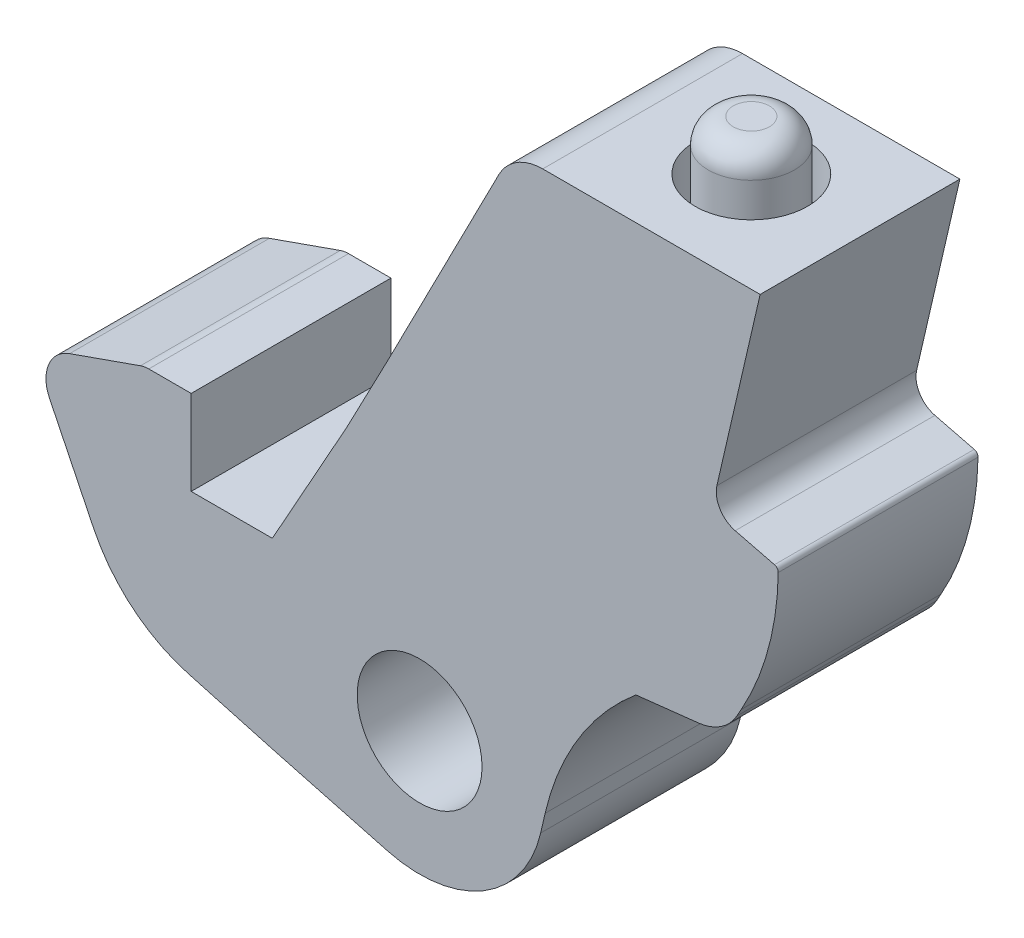
ISO-10303-21;
HEADER;
FILE_DESCRIPTION(('STEP AP214'),'2;1');
FILE_NAME('part.step','',(''),(''),'','','');
FILE_SCHEMA(('AUTOMOTIVE_DESIGN { 1 0 10303 214 1 1 1 1 }'));
ENDSEC;
DATA;
#1=APPLICATION_CONTEXT('core data for automotive mechanical design processes');
#2=APPLICATION_PROTOCOL_DEFINITION('international standard','automotive_design',2000,#1);
#3=PRODUCT_CONTEXT('',#1,'mechanical');
#4=PRODUCT('Part','Part','',(#3));
#5=PRODUCT_RELATED_PRODUCT_CATEGORY('part','',(#4));
#6=PRODUCT_DEFINITION_FORMATION('','',#4);
#7=PRODUCT_DEFINITION_CONTEXT('part definition',#1,'design');
#8=PRODUCT_DEFINITION('design','',#6,#7);
#9=PRODUCT_DEFINITION_SHAPE('','',#8);
#10=(LENGTH_UNIT() NAMED_UNIT(*) SI_UNIT(.MILLI.,.METRE.));
#11=(NAMED_UNIT(*) PLANE_ANGLE_UNIT() SI_UNIT($,.RADIAN.));
#12=(NAMED_UNIT(*) SI_UNIT($,.STERADIAN.) SOLID_ANGLE_UNIT());
#13=UNCERTAINTY_MEASURE_WITH_UNIT(LENGTH_MEASURE(1.E-05),#10,'distance_accuracy_value','');
#14=(GEOMETRIC_REPRESENTATION_CONTEXT(3) GLOBAL_UNCERTAINTY_ASSIGNED_CONTEXT((#13)) GLOBAL_UNIT_ASSIGNED_CONTEXT((#10,
#11,#12)) REPRESENTATION_CONTEXT('',''));
#15=CARTESIAN_POINT('',(0.,0.,0.));
#16=DIRECTION('',(0.,0.,1.));
#17=DIRECTION('',(1.,0.,0.));
#18=AXIS2_PLACEMENT_3D('',#15,#16,#17);
#19=CARTESIAN_POINT('',(-7.66797220054773,0.2710604918166,8.));
#20=DIRECTION('',(0.,0.,-1.));
#21=DIRECTION('',(-1.,0.,0.));
#22=AXIS2_PLACEMENT_3D('',#19,#20,#21);
#23=PLANE('',#22);
#24=DIRECTION('',(-1.,0.,0.));
#25=VECTOR('',#24,1.);
#26=CARTESIAN_POINT('',(-2.71922810393467,-2.1289395081834,8.));
#27=LINE('',#26,#25);
#28=CARTESIAN_POINT('',(-2.71922810393467,-2.1289395081834,8.));
#29=VERTEX_POINT('',#28);
#30=CARTESIAN_POINT('',(-5.96953612919984,-2.1289395081834,8.));
#31=VERTEX_POINT('',#30);
#32=EDGE_CURVE('E291',#29,#31,#27,.T.);
#33=ORIENTED_EDGE('',*,*,#32,.T.);
#34=DIRECTION('',(0.,1.,0.));
#35=VECTOR('',#34,1.);
#36=CARTESIAN_POINT('',(-5.96953612919984,-2.1289395081834,8.));
#37=LINE('',#36,#35);
#38=CARTESIAN_POINT('',(-5.96953612919984,1.2710604918166,8.));
#39=VERTEX_POINT('',#38);
#40=EDGE_CURVE('E148',#31,#39,#37,.T.);
#41=ORIENTED_EDGE('',*,*,#40,.T.);
#42=DIRECTION('',(-1.,0.,0.));
#43=VECTOR('',#42,1.);
#44=CARTESIAN_POINT('',(-5.96953612919984,1.2710604918166,8.));
#45=LINE('',#44,#43);
#46=CARTESIAN_POINT('',(-7.66797220054773,1.2710604918166,8.));
#47=VERTEX_POINT('',#46);
#48=EDGE_CURVE('E490',#39,#47,#45,.T.);
#49=ORIENTED_EDGE('',*,*,#48,.T.);
#50=CARTESIAN_POINT('',(-7.66797220054773,0.2710604918166,8.));
#51=DIRECTION('',(0.,0.,1.));
#52=DIRECTION('',(-1.,0.,0.));
#53=AXIS2_PLACEMENT_3D('',#50,#51,#52);
#54=CIRCLE('',#53,1.);
#55=CARTESIAN_POINT('',(-7.99980347927855,1.21439924457505,8.));
#56=VERTEX_POINT('',#55);
#57=EDGE_CURVE('E492',#47,#56,#54,.T.);
#58=ORIENTED_EDGE('',*,*,#57,.T.);
#59=DIRECTION('',(-0.943338752758449,-0.331831278730823,0.));
#60=VECTOR('',#59,1.);
#61=CARTESIAN_POINT('',(-7.99980347927855,1.21439924457505,8.));
#62=LINE('',#61,#60);
#63=CARTESIAN_POINT('',(-10.8390325666476,0.215664679800225,8.));
#64=VERTEX_POINT('',#63);
#65=EDGE_CURVE('E494',#56,#64,#62,.T.);
#66=ORIENTED_EDGE('',*,*,#65,.T.);
#67=CARTESIAN_POINT('',(-10.3692845071763,-1.1197475520644,8.));
#68=DIRECTION('',(0.,0.,1.));
#69=DIRECTION('',(1.,0.,0.));
#70=AXIS2_PLACEMENT_3D('',#67,#68,#69);
#71=CIRCLE('',#70,1.41562320848126);
#72=CARTESIAN_POINT('',(-11.6418752942782,-1.73982960871022,8.));
#73=VERTEX_POINT('',#72);
#74=EDGE_CURVE('E500',#64,#73,#71,.T.);
#75=ORIENTED_EDGE('',*,*,#74,.T.);
#76=DIRECTION('',(0.438027614220226,-0.898961517074305,0.));
#77=VECTOR('',#76,1.);
#78=CARTESIAN_POINT('',(-9.88186594515273,-5.35188652747633,8.));
#79=LINE('',#78,#77);
#80=CARTESIAN_POINT('',(-9.88186594515273,-5.35188652747633,8.));
#81=VERTEX_POINT('',#80);
#82=EDGE_CURVE('E502',#73,#81,#79,.T.);
#83=ORIENTED_EDGE('',*,*,#82,.T.);
#84=CARTESIAN_POINT('',(-4.4880968427069,-2.72372084215497,8.));
#85=DIRECTION('',(0.,0.,1.));
#86=DIRECTION('',(1.,0.,0.));
#87=AXIS2_PLACEMENT_3D('',#84,#85,#86);
#88=CIRCLE('',#87,6.);
#89=CARTESIAN_POINT('',(-6.08665836566715,-8.50685157362828,8.));
#90=VERTEX_POINT('',#89);
#91=EDGE_CURVE('E504',#81,#90,#88,.T.);
#92=ORIENTED_EDGE('',*,*,#91,.T.);
#93=DIRECTION('',(0.963855121912218,-0.266426920493374,0.));
#94=VECTOR('',#93,1.);
#95=CARTESIAN_POINT('',(-6.08665836566715,-8.50685157362828,8.));
#96=LINE('',#95,#94);
#97=CARTESIAN_POINT('',(-2.71392287900027,-9.43913642528591,8.));
#98=VERTEX_POINT('',#97);
#99=EDGE_CURVE('E506',#90,#98,#96,.T.);
#100=ORIENTED_EDGE('',*,*,#99,.T.);
#101=DIRECTION('',(0.966344454252272,-0.257251619500982,0.));
#102=VECTOR('',#101,1.);
#103=CARTESIAN_POINT('',(1.89917723923317,-10.6671948790947,8.));
#104=LINE('',#103,#102);
#105=CARTESIAN_POINT('',(1.89917723923317,-10.6671948790947,8.));
#106=VERTEX_POINT('',#105);
#107=EDGE_CURVE('E508',#98,#106,#104,.T.);
#108=ORIENTED_EDGE('',*,*,#107,.T.);
#109=CARTESIAN_POINT('',(3.17902607404032,-5.85954847361733,8.));
#110=DIRECTION('',(0.,0.,1.));
#111=DIRECTION('',(1.,0.,0.));
#112=AXIS2_PLACEMENT_3D('',#109,#110,#111);
#113=CIRCLE('',#112,4.9750856274095);
#114=CARTESIAN_POINT('',(8.02648483941013,-6.97920043654865,8.));
#115=VERTEX_POINT('',#114);
#116=EDGE_CURVE('E510',#106,#115,#113,.T.);
#117=ORIENTED_EDGE('',*,*,#116,.T.);
#118=DIRECTION('',(0.225051797453046,0.974346800920059,0.));
#119=VECTOR('',#118,1.);
#120=CARTESIAN_POINT('',(8.20546683586904,-6.20430977739535,8.));
#121=LINE('',#120,#119);
#122=CARTESIAN_POINT('',(8.20546683586904,-6.20430977739535,8.));
#123=VERTEX_POINT('',#122);
#124=EDGE_CURVE('E512',#115,#123,#121,.T.);
#125=ORIENTED_EDGE('',*,*,#124,.T.);
#126=CARTESIAN_POINT('',(18.8518579242714,-8.66338230533976,8.));
#127=DIRECTION('',(0.,0.,-1.));
#128=DIRECTION('',(1.,0.,0.));
#129=AXIS2_PLACEMENT_3D('',#126,#127,#128);
#130=CIRCLE('',#129,10.92669579081);
#131=CARTESIAN_POINT('',(11.8423294646064,-0.281306686613192,8.));
#132=VERTEX_POINT('',#131);
#133=EDGE_CURVE('E514',#123,#132,#130,.T.);
#134=ORIENTED_EDGE('',*,*,#133,.T.);
#135=DIRECTION('',(0.993792815702661,0.111246750324564,0.));
#136=VECTOR('',#135,1.);
#137=CARTESIAN_POINT('',(11.8423294646064,-0.281306686613192,8.));
#138=LINE('',#137,#136);
#139=CARTESIAN_POINT('',(14.3609080160023,0.000627007063032023,8.));
#140=VERTEX_POINT('',#139);
#141=EDGE_CURVE('E516',#132,#140,#138,.T.);
#142=ORIENTED_EDGE('',*,*,#141,.T.);
#143=CARTESIAN_POINT('',(14.1384145153532,1.98821263846836,8.));
#144=DIRECTION('',(0.,0.,1.));
#145=DIRECTION('',(-1.,0.,0.));
#146=AXIS2_PLACEMENT_3D('',#143,#144,#145);
#147=CIRCLE('',#146,2.);
#148=CARTESIAN_POINT('',(15.8802159379173,1.00529463356989,8.));
#149=VERTEX_POINT('',#148);
#150=EDGE_CURVE('E518',#140,#149,#147,.T.);
#151=ORIENTED_EDGE('',*,*,#150,.T.);
#152=DIRECTION('',(0.491459002449233,0.870900711282064,0.));
#153=VECTOR('',#152,1.);
#154=CARTESIAN_POINT('',(16.0590036028425,1.32211923903205,8.));
#155=LINE('',#154,#153);
#156=CARTESIAN_POINT('',(16.0590036028425,1.32211923903206,8.));
#157=VERTEX_POINT('',#156);
#158=EDGE_CURVE('E520',#149,#157,#155,.T.);
#159=ORIENTED_EDGE('',*,*,#158,.T.);
#160=CARTESIAN_POINT('',(6.04585510169578,6.97265082087592,8.));
#161=DIRECTION('',(0.,0.,1.));
#162=DIRECTION('',(-1.,0.,0.));
#163=AXIS2_PLACEMENT_3D('',#160,#161,#162);
#164=CIRCLE('',#163,11.4974627663425);
#165=CARTESIAN_POINT('',(17.5422212226345,6.81385511323671,8.));
#166=VERTEX_POINT('',#165);
#167=EDGE_CURVE('E522',#157,#166,#164,.T.);
#168=ORIENTED_EDGE('',*,*,#167,.T.);
#169=CARTESIAN_POINT('',(17.3422402989373,6.81661738715516,8.));
#170=DIRECTION('',(0.,0.,1.));
#171=DIRECTION('',(-1.,0.,0.));
#172=AXIS2_PLACEMENT_3D('',#169,#170,#171);
#173=CIRCLE('',#172,0.199999999999999);
#174=CARTESIAN_POINT('',(17.3905708662559,7.01068994127517,8.));
#175=VERTEX_POINT('',#174);
#176=EDGE_CURVE('E524',#166,#175,#173,.T.);
#177=ORIENTED_EDGE('',*,*,#176,.T.);
#178=DIRECTION('',(-0.970362770600016,0.241652836593037,0.));
#179=VECTOR('',#178,1.);
#180=CARTESIAN_POINT('',(15.8173507662495,7.40247444833808,8.));
#181=LINE('',#180,#179);
#182=CARTESIAN_POINT('',(15.8173507662495,7.40247444833808,8.));
#183=VERTEX_POINT('',#182);
#184=EDGE_CURVE('E526',#175,#183,#181,.T.);
#185=ORIENTED_EDGE('',*,*,#184,.T.);
#186=CARTESIAN_POINT('',(16.0590036028425,8.37283721893809,8.));
#187=DIRECTION('',(0.,0.,-1.));
#188=DIRECTION('',(1.,0.,0.));
#189=AXIS2_PLACEMENT_3D('',#186,#187,#188);
#190=CIRCLE('',#189,0.999999999999997);
#191=CARTESIAN_POINT('',(15.0846568019225,8.59788901639114,8.));
#192=VERTEX_POINT('',#191);
#193=EDGE_CURVE('E528',#183,#192,#190,.T.);
#194=ORIENTED_EDGE('',*,*,#193,.T.);
#195=DIRECTION('',(0.225051797453045,0.974346800920059,0.));
#196=VECTOR('',#195,1.);
#197=CARTESIAN_POINT('',(16.8169850440884,16.0978890163911,8.));
#198=LINE('',#197,#196);
#199=CARTESIAN_POINT('',(16.8169850440884,16.0978890163911,8.));
#200=VERTEX_POINT('',#199);
#201=EDGE_CURVE('E530',#192,#200,#198,.T.);
#202=ORIENTED_EDGE('',*,*,#201,.T.);
#203=DIRECTION('',(-1.,0.,0.));
#204=VECTOR('',#203,1.);
#205=CARTESIAN_POINT('',(13.7243034998767,16.0978890163912,8.));
#206=LINE('',#205,#204);
#207=CARTESIAN_POINT('',(8.11083442545163,16.0978890163912,8.));
#208=VERTEX_POINT('',#207);
#209=EDGE_CURVE('E532',#200,#208,#206,.T.);
#210=ORIENTED_EDGE('',*,*,#209,.T.);
#211=CARTESIAN_POINT('',(8.11083442545163,14.122920038043,8.));
#212=DIRECTION('',(0.,0.,1.));
#213=DIRECTION('',(1.,0.,0.));
#214=AXIS2_PLACEMENT_3D('',#211,#212,#213);
#215=CIRCLE('',#214,1.97496897834821);
#216=CARTESIAN_POINT('',(6.35357532167206,15.0243316574609,8.));
#217=VERTEX_POINT('',#216);
#218=EDGE_CURVE('E221',#208,#217,#215,.T.);
#219=ORIENTED_EDGE('',*,*,#218,.T.);
#220=DIRECTION('',(-0.45641811557558,-0.889765420644361,0.));
#221=VECTOR('',#220,1.);
#222=CARTESIAN_POINT('',(1.89917723923319,6.34069433394995,8.));
#223=LINE('',#222,#221);
#224=CARTESIAN_POINT('',(1.89917723923319,6.34069433394995,8.));
#225=VERTEX_POINT('',#224);
#226=EDGE_CURVE('E215',#217,#225,#223,.T.);
#227=ORIENTED_EDGE('',*,*,#226,.T.);
#228=DIRECTION('',(-0.463424730649865,-0.886136286934521,0.));
#229=VECTOR('',#228,1.);
#230=CARTESIAN_POINT('',(0.263428455002605,3.21290192636068,8.));
#231=LINE('',#230,#229);
#232=CARTESIAN_POINT('',(0.263428455002605,3.21290192636068,8.));
#233=VERTEX_POINT('',#232);
#234=EDGE_CURVE('E219',#225,#233,#231,.T.);
#235=ORIENTED_EDGE('',*,*,#234,.T.);
#236=DIRECTION('',(-0.487511174764697,-0.873116747336543,0.));
#237=VECTOR('',#236,1.);
#238=CARTESIAN_POINT('',(-2.71922810393467,-2.1289395081834,8.));
#239=LINE('',#238,#237);
#240=EDGE_CURVE('E50',#233,#29,#239,.T.);
#241=ORIENTED_EDGE('',*,*,#240,.T.);
#242=EDGE_LOOP('',(#33,#41,#49,#58,#66,#75,#83,#92,#100,#108,#117,#125,#134,#142,#151,#159,#168,
#177,#185,#194,#202,#210,#219,#227,#235,#241));
#243=FACE_BOUND('',#242,.T.);
#244=CARTESIAN_POINT('',(3.17902607404032,-5.85954847361733,8.));
#245=DIRECTION('',(0.,0.,1.));
#246=DIRECTION('',(1.,0.,0.));
#247=AXIS2_PLACEMENT_3D('',#244,#245,#246);
#248=CIRCLE('',#247,2.50000000000386);
#249=CARTESIAN_POINT('',(5.67902607404418,-5.85954847361733,8.));
#250=VERTEX_POINT('',#249);
#251=EDGE_CURVE('E243',#250,#250,#248,.T.);
#252=ORIENTED_EDGE('',*,*,#251,.F.);
#253=EDGE_LOOP('',(#252));
#254=FACE_BOUND('',#253,.T.);
#255=ADVANCED_FACE('F33',(#243,#254),#23,.F.);
#256=CARTESIAN_POINT('',(-7.66797220054773,0.2710604918166,0.));
#257=DIRECTION('',(0.,0.,-1.));
#258=DIRECTION('',(-1.,0.,0.));
#259=AXIS2_PLACEMENT_3D('',#256,#257,#258);
#260=PLANE('',#259);
#261=DIRECTION('',(-1.,0.,0.));
#262=VECTOR('',#261,1.);
#263=CARTESIAN_POINT('',(-2.71922810393467,-2.1289395081834,0.));
#264=LINE('',#263,#262);
#265=CARTESIAN_POINT('',(-2.71922810393467,-2.1289395081834,0.));
#266=VERTEX_POINT('',#265);
#267=CARTESIAN_POINT('',(-5.96953612919984,-2.1289395081834,0.));
#268=VERTEX_POINT('',#267);
#269=EDGE_CURVE('E239',#266,#268,#264,.T.);
#270=ORIENTED_EDGE('',*,*,#269,.F.);
#271=DIRECTION('',(-0.487511174764697,-0.873116747336543,0.));
#272=VECTOR('',#271,1.);
#273=CARTESIAN_POINT('',(-2.71922810393467,-2.1289395081834,0.));
#274=LINE('',#273,#272);
#275=CARTESIAN_POINT('',(0.263428455002605,3.21290192636068,0.));
#276=VERTEX_POINT('',#275);
#277=EDGE_CURVE('E139',#276,#266,#274,.T.);
#278=ORIENTED_EDGE('',*,*,#277,.F.);
#279=DIRECTION('',(-0.463424730649865,-0.886136286934521,0.));
#280=VECTOR('',#279,1.);
#281=CARTESIAN_POINT('',(0.263428455002605,3.21290192636068,0.));
#282=LINE('',#281,#280);
#283=CARTESIAN_POINT('',(1.89917723923319,6.34069433394995,0.));
#284=VERTEX_POINT('',#283);
#285=EDGE_CURVE('E133',#284,#276,#282,.T.);
#286=ORIENTED_EDGE('',*,*,#285,.F.);
#287=DIRECTION('',(-0.45641811557558,-0.889765420644361,0.));
#288=VECTOR('',#287,1.);
#289=CARTESIAN_POINT('',(1.89917723923319,6.34069433394995,0.));
#290=LINE('',#289,#288);
#291=CARTESIAN_POINT('',(6.35357532167206,15.0243316574609,0.));
#292=VERTEX_POINT('',#291);
#293=EDGE_CURVE('E229',#292,#284,#290,.T.);
#294=ORIENTED_EDGE('',*,*,#293,.F.);
#295=CARTESIAN_POINT('',(8.11083442545163,14.122920038043,0.));
#296=DIRECTION('',(0.,0.,1.));
#297=DIRECTION('',(1.,0.,0.));
#298=AXIS2_PLACEMENT_3D('',#295,#296,#297);
#299=CIRCLE('',#298,1.97496897834821);
#300=CARTESIAN_POINT('',(8.11083442545163,16.0978890163912,0.));
#301=VERTEX_POINT('',#300);
#302=EDGE_CURVE('E286',#301,#292,#299,.T.);
#303=ORIENTED_EDGE('',*,*,#302,.F.);
#304=DIRECTION('',(-1.,0.,0.));
#305=VECTOR('',#304,1.);
#306=CARTESIAN_POINT('',(8.11083442545163,16.0978890163912,0.));
#307=LINE('',#306,#305);
#308=CARTESIAN_POINT('',(16.8169850440884,16.0978890163911,0.));
#309=VERTEX_POINT('',#308);
#310=EDGE_CURVE('E284',#309,#301,#307,.T.);
#311=ORIENTED_EDGE('',*,*,#310,.F.);
#312=DIRECTION('',(0.225051797453045,0.974346800920059,0.));
#313=VECTOR('',#312,1.);
#314=CARTESIAN_POINT('',(16.8169850440884,16.0978890163911,0.));
#315=LINE('',#314,#313);
#316=CARTESIAN_POINT('',(15.0846568019225,8.59788901639114,0.));
#317=VERTEX_POINT('',#316);
#318=EDGE_CURVE('E281',#317,#309,#315,.T.);
#319=ORIENTED_EDGE('',*,*,#318,.F.);
#320=CARTESIAN_POINT('',(16.0590036028425,8.37283721893809,0.));
#321=DIRECTION('',(0.,0.,-1.));
#322=DIRECTION('',(1.,0.,0.));
#323=AXIS2_PLACEMENT_3D('',#320,#321,#322);
#324=CIRCLE('',#323,0.999999999999997);
#325=CARTESIAN_POINT('',(15.8173507662495,7.40247444833808,0.));
#326=VERTEX_POINT('',#325);
#327=EDGE_CURVE('E279',#326,#317,#324,.T.);
#328=ORIENTED_EDGE('',*,*,#327,.F.);
#329=DIRECTION('',(-0.970362770600016,0.241652836593037,0.));
#330=VECTOR('',#329,1.);
#331=CARTESIAN_POINT('',(15.8173507662495,7.40247444833808,0.));
#332=LINE('',#331,#330);
#333=CARTESIAN_POINT('',(17.3905708662559,7.01068994127517,0.));
#334=VERTEX_POINT('',#333);
#335=EDGE_CURVE('E277',#334,#326,#332,.T.);
#336=ORIENTED_EDGE('',*,*,#335,.F.);
#337=CARTESIAN_POINT('',(17.3422402989373,6.81661738715516,0.));
#338=DIRECTION('',(0.,0.,1.));
#339=DIRECTION('',(-1.,0.,0.));
#340=AXIS2_PLACEMENT_3D('',#337,#338,#339);
#341=CIRCLE('',#340,0.199999999999999);
#342=CARTESIAN_POINT('',(17.5422212226345,6.81385511323671,0.));
#343=VERTEX_POINT('',#342);
#344=EDGE_CURVE('E275',#343,#334,#341,.T.);
#345=ORIENTED_EDGE('',*,*,#344,.F.);
#346=CARTESIAN_POINT('',(6.04585510169578,6.97265082087592,0.));
#347=DIRECTION('',(0.,0.,1.));
#348=DIRECTION('',(-1.,0.,0.));
#349=AXIS2_PLACEMENT_3D('',#346,#347,#348);
#350=CIRCLE('',#349,11.4974627663425);
#351=CARTESIAN_POINT('',(16.0590036028425,1.32211923903206,0.));
#352=VERTEX_POINT('',#351);
#353=EDGE_CURVE('E273',#352,#343,#350,.T.);
#354=ORIENTED_EDGE('',*,*,#353,.F.);
#355=DIRECTION('',(0.491459002449233,0.870900711282064,0.));
#356=VECTOR('',#355,1.);
#357=CARTESIAN_POINT('',(16.0590036028425,1.32211923903205,0.));
#358=LINE('',#357,#356);
#359=CARTESIAN_POINT('',(15.8802159379173,1.00529463356989,0.));
#360=VERTEX_POINT('',#359);
#361=EDGE_CURVE('E271',#360,#352,#358,.T.);
#362=ORIENTED_EDGE('',*,*,#361,.F.);
#363=CARTESIAN_POINT('',(14.1384145153532,1.98821263846836,0.));
#364=DIRECTION('',(0.,0.,1.));
#365=DIRECTION('',(-1.,0.,0.));
#366=AXIS2_PLACEMENT_3D('',#363,#364,#365);
#367=CIRCLE('',#366,2.);
#368=CARTESIAN_POINT('',(14.3609080160023,0.000627007063032023,0.));
#369=VERTEX_POINT('',#368);
#370=EDGE_CURVE('E269',#369,#360,#367,.T.);
#371=ORIENTED_EDGE('',*,*,#370,.F.);
#372=DIRECTION('',(0.993792815702661,0.111246750324564,0.));
#373=VECTOR('',#372,1.);
#374=CARTESIAN_POINT('',(11.8423294646064,-0.281306686613192,0.));
#375=LINE('',#374,#373);
#376=CARTESIAN_POINT('',(11.8423294646064,-0.281306686613192,0.));
#377=VERTEX_POINT('',#376);
#378=EDGE_CURVE('E267',#377,#369,#375,.T.);
#379=ORIENTED_EDGE('',*,*,#378,.F.);
#380=CARTESIAN_POINT('',(18.8518579242714,-8.66338230533976,0.));
#381=DIRECTION('',(0.,0.,-1.));
#382=DIRECTION('',(1.,0.,0.));
#383=AXIS2_PLACEMENT_3D('',#380,#381,#382);
#384=CIRCLE('',#383,10.92669579081);
#385=CARTESIAN_POINT('',(8.20546683586904,-6.20430977739535,0.));
#386=VERTEX_POINT('',#385);
#387=EDGE_CURVE('E265',#386,#377,#384,.T.);
#388=ORIENTED_EDGE('',*,*,#387,.F.);
#389=DIRECTION('',(0.225051797453046,0.974346800920059,0.));
#390=VECTOR('',#389,1.);
#391=CARTESIAN_POINT('',(8.20546683586904,-6.20430977739535,0.));
#392=LINE('',#391,#390);
#393=CARTESIAN_POINT('',(8.02648483941013,-6.97920043654865,0.));
#394=VERTEX_POINT('',#393);
#395=EDGE_CURVE('E263',#394,#386,#392,.T.);
#396=ORIENTED_EDGE('',*,*,#395,.F.);
#397=CARTESIAN_POINT('',(3.17902607404032,-5.85954847361733,0.));
#398=DIRECTION('',(0.,0.,1.));
#399=DIRECTION('',(1.,0.,0.));
#400=AXIS2_PLACEMENT_3D('',#397,#398,#399);
#401=CIRCLE('',#400,4.9750856274095);
#402=CARTESIAN_POINT('',(1.89917723923317,-10.6671948790947,0.));
#403=VERTEX_POINT('',#402);
#404=EDGE_CURVE('E261',#403,#394,#401,.T.);
#405=ORIENTED_EDGE('',*,*,#404,.F.);
#406=DIRECTION('',(0.966344454252272,-0.257251619500982,0.));
#407=VECTOR('',#406,1.);
#408=CARTESIAN_POINT('',(1.89917723923317,-10.6671948790947,0.));
#409=LINE('',#408,#407);
#410=CARTESIAN_POINT('',(-2.71392287900027,-9.43913642528591,0.));
#411=VERTEX_POINT('',#410);
#412=EDGE_CURVE('E259',#411,#403,#409,.T.);
#413=ORIENTED_EDGE('',*,*,#412,.F.);
#414=DIRECTION('',(0.963855121912218,-0.266426920493374,0.));
#415=VECTOR('',#414,1.);
#416=CARTESIAN_POINT('',(-6.08665836566715,-8.50685157362828,0.));
#417=LINE('',#416,#415);
#418=CARTESIAN_POINT('',(-6.08665836566715,-8.50685157362828,0.));
#419=VERTEX_POINT('',#418);
#420=EDGE_CURVE('E257',#419,#411,#417,.T.);
#421=ORIENTED_EDGE('',*,*,#420,.F.);
#422=CARTESIAN_POINT('',(-4.4880968427069,-2.72372084215497,0.));
#423=DIRECTION('',(0.,0.,1.));
#424=DIRECTION('',(1.,0.,0.));
#425=AXIS2_PLACEMENT_3D('',#422,#423,#424);
#426=CIRCLE('',#425,6.);
#427=CARTESIAN_POINT('',(-9.88186594515273,-5.35188652747633,0.));
#428=VERTEX_POINT('',#427);
#429=EDGE_CURVE('E255',#428,#419,#426,.T.);
#430=ORIENTED_EDGE('',*,*,#429,.F.);
#431=DIRECTION('',(0.438027614220226,-0.898961517074305,0.));
#432=VECTOR('',#431,1.);
#433=CARTESIAN_POINT('',(-9.88186594515273,-5.35188652747633,0.));
#434=LINE('',#433,#432);
#435=CARTESIAN_POINT('',(-11.6418752942782,-1.73982960871022,0.));
#436=VERTEX_POINT('',#435);
#437=EDGE_CURVE('E253',#436,#428,#434,.T.);
#438=ORIENTED_EDGE('',*,*,#437,.F.);
#439=CARTESIAN_POINT('',(-10.3692845071763,-1.1197475520644,0.));
#440=DIRECTION('',(0.,0.,1.));
#441=DIRECTION('',(1.,0.,0.));
#442=AXIS2_PLACEMENT_3D('',#439,#440,#441);
#443=CIRCLE('',#442,1.41562320848126);
#444=CARTESIAN_POINT('',(-10.8390325666476,0.215664679800225,0.));
#445=VERTEX_POINT('',#444);
#446=EDGE_CURVE('E251',#445,#436,#443,.T.);
#447=ORIENTED_EDGE('',*,*,#446,.F.);
#448=DIRECTION('',(-0.943338752758449,-0.331831278730823,0.));
#449=VECTOR('',#448,1.);
#450=CARTESIAN_POINT('',(-7.99980347927855,1.21439924457505,0.));
#451=LINE('',#450,#449);
#452=CARTESIAN_POINT('',(-7.99980347927855,1.21439924457505,0.));
#453=VERTEX_POINT('',#452);
#454=EDGE_CURVE('E249',#453,#445,#451,.T.);
#455=ORIENTED_EDGE('',*,*,#454,.F.);
#456=CARTESIAN_POINT('',(-7.66797220054773,0.2710604918166,0.));
#457=DIRECTION('',(0.,0.,1.));
#458=DIRECTION('',(-1.,0.,0.));
#459=AXIS2_PLACEMENT_3D('',#456,#457,#458);
#460=CIRCLE('',#459,1.);
#461=CARTESIAN_POINT('',(-7.66797220054773,1.2710604918166,0.));
#462=VERTEX_POINT('',#461);
#463=EDGE_CURVE('E247',#462,#453,#460,.T.);
#464=ORIENTED_EDGE('',*,*,#463,.F.);
#465=DIRECTION('',(-1.,0.,0.));
#466=VECTOR('',#465,1.);
#467=CARTESIAN_POINT('',(-5.96953612919984,1.2710604918166,0.));
#468=LINE('',#467,#466);
#469=CARTESIAN_POINT('',(-5.96953612919984,1.2710604918166,0.));
#470=VERTEX_POINT('',#469);
#471=EDGE_CURVE('E245',#470,#462,#468,.T.);
#472=ORIENTED_EDGE('',*,*,#471,.F.);
#473=DIRECTION('',(0.,1.,0.));
#474=VECTOR('',#473,1.);
#475=CARTESIAN_POINT('',(-5.96953612919984,-2.1289395081834,0.));
#476=LINE('',#475,#474);
#477=EDGE_CURVE('E242',#268,#470,#476,.T.);
#478=ORIENTED_EDGE('',*,*,#477,.F.);
#479=EDGE_LOOP('',(#270,#278,#286,#294,#303,#311,#319,#328,#336,#345,#354,#362,#371,#379,#388,
#396,#405,#413,#421,#430,#438,#447,#455,#464,#472,#478));
#480=FACE_BOUND('',#479,.T.);
#481=CARTESIAN_POINT('',(3.17902607404032,-5.85954847361733,0.));
#482=DIRECTION('',(0.,0.,1.));
#483=DIRECTION('',(1.,0.,0.));
#484=AXIS2_PLACEMENT_3D('',#481,#482,#483);
#485=CIRCLE('',#484,2.50000000000386);
#486=CARTESIAN_POINT('',(5.67902607404418,-5.85954847361733,0.));
#487=VERTEX_POINT('',#486);
#488=EDGE_CURVE('E590',#487,#487,#485,.T.);
#489=ORIENTED_EDGE('',*,*,#488,.T.);
#490=EDGE_LOOP('',(#489));
#491=FACE_BOUND('',#490,.T.);
#492=ADVANCED_FACE('F373',(#480,#491),#260,.T.);
#493=CARTESIAN_POINT('',(-2.71922810393467,-2.1289395081834,8.));
#494=DIRECTION('',(0.,-1.,0.));
#495=DIRECTION('',(1.,0.,0.));
#496=AXIS2_PLACEMENT_3D('',#493,#494,#495);
#497=PLANE('',#496);
#498=ORIENTED_EDGE('',*,*,#269,.T.);
#499=DIRECTION('',(0.,0.,-1.));
#500=VECTOR('',#499,1.);
#501=CARTESIAN_POINT('',(-5.96953612919984,-2.1289395081834,8.));
#502=LINE('',#501,#500);
#503=EDGE_CURVE('E358',#31,#268,#502,.T.);
#504=ORIENTED_EDGE('',*,*,#503,.F.);
#505=ORIENTED_EDGE('',*,*,#32,.F.);
#506=DIRECTION('',(0.,0.,-1.));
#507=VECTOR('',#506,1.);
#508=CARTESIAN_POINT('',(-2.71922810393467,-2.1289395081834,8.));
#509=LINE('',#508,#507);
#510=EDGE_CURVE('E235',#29,#266,#509,.T.);
#511=ORIENTED_EDGE('',*,*,#510,.T.);
#512=EDGE_LOOP('',(#498,#504,#505,#511));
#513=FACE_BOUND('',#512,.T.);
#514=ADVANCED_FACE('F378',(#513),#497,.F.);
#515=CARTESIAN_POINT('',(-5.96953612919984,-2.1289395081834,8.));
#516=DIRECTION('',(-1.,0.,0.));
#517=DIRECTION('',(0.,0.,1.));
#518=AXIS2_PLACEMENT_3D('',#515,#516,#517);
#519=PLANE('',#518);
#520=ORIENTED_EDGE('',*,*,#477,.T.);
#521=DIRECTION('',(0.,0.,-1.));
#522=VECTOR('',#521,1.);
#523=CARTESIAN_POINT('',(-5.96953612919984,1.2710604918166,8.));
#524=LINE('',#523,#522);
#525=EDGE_CURVE('E355',#39,#470,#524,.T.);
#526=ORIENTED_EDGE('',*,*,#525,.F.);
#527=ORIENTED_EDGE('',*,*,#40,.F.);
#528=ORIENTED_EDGE('',*,*,#503,.T.);
#529=EDGE_LOOP('',(#520,#526,#527,#528));
#530=FACE_BOUND('',#529,.T.);
#531=ADVANCED_FACE('F475',(#530),#519,.F.);
#532=CARTESIAN_POINT('',(-5.96953612919984,1.2710604918166,8.));
#533=DIRECTION('',(0.,-1.,0.));
#534=DIRECTION('',(1.,0.,0.));
#535=AXIS2_PLACEMENT_3D('',#532,#533,#534);
#536=PLANE('',#535);
#537=ORIENTED_EDGE('',*,*,#471,.T.);
#538=DIRECTION('',(0.,0.,-1.));
#539=VECTOR('',#538,1.);
#540=CARTESIAN_POINT('',(-7.66797220054773,1.2710604918166,8.));
#541=LINE('',#540,#539);
#542=EDGE_CURVE('E352',#47,#462,#541,.T.);
#543=ORIENTED_EDGE('',*,*,#542,.F.);
#544=ORIENTED_EDGE('',*,*,#48,.F.);
#545=ORIENTED_EDGE('',*,*,#525,.T.);
#546=EDGE_LOOP('',(#537,#543,#544,#545));
#547=FACE_BOUND('',#546,.T.);
#548=ADVANCED_FACE('F471',(#547),#536,.F.);
#549=CARTESIAN_POINT('',(-7.66797220054773,0.2710604918166,8.));
#550=DIRECTION('',(0.,0.,-1.));
#551=DIRECTION('',(-1.,0.,0.));
#552=AXIS2_PLACEMENT_3D('',#549,#550,#551);
#553=CYLINDRICAL_SURFACE('',#552,1.);
#554=ORIENTED_EDGE('',*,*,#463,.T.);
#555=DIRECTION('',(0.,0.,-1.));
#556=VECTOR('',#555,1.);
#557=CARTESIAN_POINT('',(-7.99980347927855,1.21439924457505,8.));
#558=LINE('',#557,#556);
#559=EDGE_CURVE('E349',#56,#453,#558,.T.);
#560=ORIENTED_EDGE('',*,*,#559,.F.);
#561=ORIENTED_EDGE('',*,*,#57,.F.);
#562=ORIENTED_EDGE('',*,*,#542,.T.);
#563=EDGE_LOOP('',(#554,#560,#561,#562));
#564=FACE_BOUND('',#563,.T.);
#565=ADVANCED_FACE('F467',(#564),#553,.T.);
#566=CARTESIAN_POINT('',(-7.99980347927855,1.21439924457505,8.));
#567=DIRECTION('',(0.331831278730823,-0.943338752758449,0.));
#568=DIRECTION('',(0.943338752758449,0.331831278730823,0.));
#569=AXIS2_PLACEMENT_3D('',#566,#567,#568);
#570=PLANE('',#569);
#571=ORIENTED_EDGE('',*,*,#454,.T.);
#572=DIRECTION('',(0.,0.,-1.));
#573=VECTOR('',#572,1.);
#574=CARTESIAN_POINT('',(-10.8390325666476,0.215664679800225,8.));
#575=LINE('',#574,#573);
#576=EDGE_CURVE('E346',#64,#445,#575,.T.);
#577=ORIENTED_EDGE('',*,*,#576,.F.);
#578=ORIENTED_EDGE('',*,*,#65,.F.);
#579=ORIENTED_EDGE('',*,*,#559,.T.);
#580=EDGE_LOOP('',(#571,#577,#578,#579));
#581=FACE_BOUND('',#580,.T.);
#582=ADVANCED_FACE('F463',(#581),#570,.F.);
#583=CARTESIAN_POINT('',(-10.3692845071763,-1.1197475520644,8.));
#584=DIRECTION('',(0.,0.,-1.));
#585=DIRECTION('',(-1.,0.,0.));
#586=AXIS2_PLACEMENT_3D('',#583,#584,#585);
#587=CYLINDRICAL_SURFACE('',#586,1.41562320848126);
#588=ORIENTED_EDGE('',*,*,#446,.T.);
#589=DIRECTION('',(0.,0.,-1.));
#590=VECTOR('',#589,1.);
#591=CARTESIAN_POINT('',(-11.6418752942782,-1.73982960871022,8.));
#592=LINE('',#591,#590);
#593=EDGE_CURVE('E343',#73,#436,#592,.T.);
#594=ORIENTED_EDGE('',*,*,#593,.F.);
#595=ORIENTED_EDGE('',*,*,#74,.F.);
#596=ORIENTED_EDGE('',*,*,#576,.T.);
#597=EDGE_LOOP('',(#588,#594,#595,#596));
#598=FACE_BOUND('',#597,.T.);
#599=ADVANCED_FACE('F459',(#598),#587,.T.);
#600=CARTESIAN_POINT('',(-9.88186594515273,-5.35188652747633,8.));
#601=DIRECTION('',(0.898961517074306,0.438027614220226,0.));
#602=DIRECTION('',(-0.438027614220226,0.898961517074306,0.));
#603=AXIS2_PLACEMENT_3D('',#600,#601,#602);
#604=PLANE('',#603);
#605=ORIENTED_EDGE('',*,*,#437,.T.);
#606=DIRECTION('',(0.,0.,-1.));
#607=VECTOR('',#606,1.);
#608=CARTESIAN_POINT('',(-9.88186594515273,-5.35188652747633,8.));
#609=LINE('',#608,#607);
#610=EDGE_CURVE('E340',#81,#428,#609,.T.);
#611=ORIENTED_EDGE('',*,*,#610,.F.);
#612=ORIENTED_EDGE('',*,*,#82,.F.);
#613=ORIENTED_EDGE('',*,*,#593,.T.);
#614=EDGE_LOOP('',(#605,#611,#612,#613));
#615=FACE_BOUND('',#614,.T.);
#616=ADVANCED_FACE('F455',(#615),#604,.F.);
#617=CARTESIAN_POINT('',(-4.4880968427069,-2.72372084215497,8.));
#618=DIRECTION('',(0.,0.,-1.));
#619=DIRECTION('',(-1.,0.,0.));
#620=AXIS2_PLACEMENT_3D('',#617,#618,#619);
#621=CYLINDRICAL_SURFACE('',#620,6.);
#622=ORIENTED_EDGE('',*,*,#429,.T.);
#623=DIRECTION('',(0.,0.,-1.));
#624=VECTOR('',#623,1.);
#625=CARTESIAN_POINT('',(-6.08665836566715,-8.50685157362828,8.));
#626=LINE('',#625,#624);
#627=EDGE_CURVE('E337',#90,#419,#626,.T.);
#628=ORIENTED_EDGE('',*,*,#627,.F.);
#629=ORIENTED_EDGE('',*,*,#91,.F.);
#630=ORIENTED_EDGE('',*,*,#610,.T.);
#631=EDGE_LOOP('',(#622,#628,#629,#630));
#632=FACE_BOUND('',#631,.T.);
#633=ADVANCED_FACE('F451',(#632),#621,.T.);
#634=CARTESIAN_POINT('',(-6.08665836566715,-8.50685157362828,8.));
#635=DIRECTION('',(0.266426920493374,0.963855121912218,0.));
#636=DIRECTION('',(-0.963855121912218,0.266426920493374,0.));
#637=AXIS2_PLACEMENT_3D('',#634,#635,#636);
#638=PLANE('',#637);
#639=ORIENTED_EDGE('',*,*,#420,.T.);
#640=DIRECTION('',(0.,0.,-1.));
#641=VECTOR('',#640,1.);
#642=CARTESIAN_POINT('',(-2.71392287900027,-9.43913642528591,8.));
#643=LINE('',#642,#641);
#644=EDGE_CURVE('E334',#98,#411,#643,.T.);
#645=ORIENTED_EDGE('',*,*,#644,.F.);
#646=ORIENTED_EDGE('',*,*,#99,.F.);
#647=ORIENTED_EDGE('',*,*,#627,.T.);
#648=EDGE_LOOP('',(#639,#645,#646,#647));
#649=FACE_BOUND('',#648,.T.);
#650=ADVANCED_FACE('F447',(#649),#638,.F.);
#651=CARTESIAN_POINT('',(1.89917723923317,-10.6671948790947,8.));
#652=DIRECTION('',(0.257251619500982,0.966344454252272,0.));
#653=DIRECTION('',(-0.966344454252272,0.257251619500982,0.));
#654=AXIS2_PLACEMENT_3D('',#651,#652,#653);
#655=PLANE('',#654);
#656=ORIENTED_EDGE('',*,*,#412,.T.);
#657=DIRECTION('',(0.,0.,-1.));
#658=VECTOR('',#657,1.);
#659=CARTESIAN_POINT('',(1.89917723923317,-10.6671948790947,8.));
#660=LINE('',#659,#658);
#661=EDGE_CURVE('E331',#106,#403,#660,.T.);
#662=ORIENTED_EDGE('',*,*,#661,.F.);
#663=ORIENTED_EDGE('',*,*,#107,.F.);
#664=ORIENTED_EDGE('',*,*,#644,.T.);
#665=EDGE_LOOP('',(#656,#662,#663,#664));
#666=FACE_BOUND('',#665,.T.);
#667=ADVANCED_FACE('F443',(#666),#655,.F.);
#668=CARTESIAN_POINT('',(3.17902607404032,-5.85954847361733,8.));
#669=DIRECTION('',(0.,0.,-1.));
#670=DIRECTION('',(-1.,0.,0.));
#671=AXIS2_PLACEMENT_3D('',#668,#669,#670);
#672=CYLINDRICAL_SURFACE('',#671,4.9750856274095);
#673=ORIENTED_EDGE('',*,*,#404,.T.);
#674=DIRECTION('',(0.,0.,-1.));
#675=VECTOR('',#674,1.);
#676=CARTESIAN_POINT('',(8.02648483941013,-6.97920043654865,8.));
#677=LINE('',#676,#675);
#678=EDGE_CURVE('E328',#115,#394,#677,.T.);
#679=ORIENTED_EDGE('',*,*,#678,.F.);
#680=ORIENTED_EDGE('',*,*,#116,.F.);
#681=ORIENTED_EDGE('',*,*,#661,.T.);
#682=EDGE_LOOP('',(#673,#679,#680,#681));
#683=FACE_BOUND('',#682,.T.);
#684=ADVANCED_FACE('F439',(#683),#672,.T.);
#685=CARTESIAN_POINT('',(8.20546683586904,-6.20430977739535,8.));
#686=DIRECTION('',(-0.974346800920059,0.225051797453046,0.));
#687=DIRECTION('',(-0.225051797453046,-0.974346800920059,0.));
#688=AXIS2_PLACEMENT_3D('',#685,#686,#687);
#689=PLANE('',#688);
#690=ORIENTED_EDGE('',*,*,#395,.T.);
#691=DIRECTION('',(0.,0.,-1.));
#692=VECTOR('',#691,1.);
#693=CARTESIAN_POINT('',(8.20546683586904,-6.20430977739535,8.));
#694=LINE('',#693,#692);
#695=EDGE_CURVE('E325',#123,#386,#694,.T.);
#696=ORIENTED_EDGE('',*,*,#695,.F.);
#697=ORIENTED_EDGE('',*,*,#124,.F.);
#698=ORIENTED_EDGE('',*,*,#678,.T.);
#699=EDGE_LOOP('',(#690,#696,#697,#698));
#700=FACE_BOUND('',#699,.T.);
#701=ADVANCED_FACE('F435',(#700),#689,.F.);
#702=CARTESIAN_POINT('',(18.8518579242714,-8.66338230533976,8.));
#703=DIRECTION('',(0.,0.,-1.));
#704=DIRECTION('',(-1.,0.,0.));
#705=AXIS2_PLACEMENT_3D('',#702,#703,#704);
#706=CYLINDRICAL_SURFACE('',#705,10.92669579081);
#707=ORIENTED_EDGE('',*,*,#387,.T.);
#708=DIRECTION('',(0.,0.,-1.));
#709=VECTOR('',#708,1.);
#710=CARTESIAN_POINT('',(11.8423294646064,-0.281306686613192,8.));
#711=LINE('',#710,#709);
#712=EDGE_CURVE('E322',#132,#377,#711,.T.);
#713=ORIENTED_EDGE('',*,*,#712,.F.);
#714=ORIENTED_EDGE('',*,*,#133,.F.);
#715=ORIENTED_EDGE('',*,*,#695,.T.);
#716=EDGE_LOOP('',(#707,#713,#714,#715));
#717=FACE_BOUND('',#716,.T.);
#718=ADVANCED_FACE('F431',(#717),#706,.F.);
#719=CARTESIAN_POINT('',(11.8423294646064,-0.281306686613192,8.));
#720=DIRECTION('',(-0.111246750324564,0.993792815702662,0.));
#721=DIRECTION('',(-0.993792815702662,-0.111246750324564,0.));
#722=AXIS2_PLACEMENT_3D('',#719,#720,#721);
#723=PLANE('',#722);
#724=ORIENTED_EDGE('',*,*,#378,.T.);
#725=DIRECTION('',(0.,0.,-1.));
#726=VECTOR('',#725,1.);
#727=CARTESIAN_POINT('',(14.3609080160023,0.000627007063032023,8.));
#728=LINE('',#727,#726);
#729=EDGE_CURVE('E319',#140,#369,#728,.T.);
#730=ORIENTED_EDGE('',*,*,#729,.F.);
#731=ORIENTED_EDGE('',*,*,#141,.F.);
#732=ORIENTED_EDGE('',*,*,#712,.T.);
#733=EDGE_LOOP('',(#724,#730,#731,#732));
#734=FACE_BOUND('',#733,.T.);
#735=ADVANCED_FACE('F427',(#734),#723,.F.);
#736=CARTESIAN_POINT('',(14.1384145153532,1.98821263846836,8.));
#737=DIRECTION('',(0.,0.,-1.));
#738=DIRECTION('',(-1.,0.,0.));
#739=AXIS2_PLACEMENT_3D('',#736,#737,#738);
#740=CYLINDRICAL_SURFACE('',#739,2.);
#741=ORIENTED_EDGE('',*,*,#370,.T.);
#742=DIRECTION('',(0.,0.,-1.));
#743=VECTOR('',#742,1.);
#744=CARTESIAN_POINT('',(15.8802159379173,1.00529463356989,8.));
#745=LINE('',#744,#743);
#746=EDGE_CURVE('E316',#149,#360,#745,.T.);
#747=ORIENTED_EDGE('',*,*,#746,.F.);
#748=ORIENTED_EDGE('',*,*,#150,.F.);
#749=ORIENTED_EDGE('',*,*,#729,.T.);
#750=EDGE_LOOP('',(#741,#747,#748,#749));
#751=FACE_BOUND('',#750,.T.);
#752=ADVANCED_FACE('F423',(#751),#740,.T.);
#753=CARTESIAN_POINT('',(16.0590036028425,1.32211923903205,8.));
#754=DIRECTION('',(-0.870900711282064,0.491459002449233,0.));
#755=DIRECTION('',(-0.491459002449233,-0.870900711282064,0.));
#756=AXIS2_PLACEMENT_3D('',#753,#754,#755);
#757=PLANE('',#756);
#758=ORIENTED_EDGE('',*,*,#361,.T.);
#759=DIRECTION('',(0.,0.,-1.));
#760=VECTOR('',#759,1.);
#761=CARTESIAN_POINT('',(16.0590036028425,1.32211923903206,8.));
#762=LINE('',#761,#760);
#763=EDGE_CURVE('E313',#157,#352,#762,.T.);
#764=ORIENTED_EDGE('',*,*,#763,.F.);
#765=ORIENTED_EDGE('',*,*,#158,.F.);
#766=ORIENTED_EDGE('',*,*,#746,.T.);
#767=EDGE_LOOP('',(#758,#764,#765,#766));
#768=FACE_BOUND('',#767,.T.);
#769=ADVANCED_FACE('F419',(#768),#757,.F.);
#770=CARTESIAN_POINT('',(6.04585510169578,6.97265082087592,8.));
#771=DIRECTION('',(0.,0.,-1.));
#772=DIRECTION('',(-1.,0.,0.));
#773=AXIS2_PLACEMENT_3D('',#770,#771,#772);
#774=CYLINDRICAL_SURFACE('',#773,11.4974627663425);
#775=ORIENTED_EDGE('',*,*,#353,.T.);
#776=DIRECTION('',(0.,0.,-1.));
#777=VECTOR('',#776,1.);
#778=CARTESIAN_POINT('',(17.5422212226345,6.81385511323671,8.));
#779=LINE('',#778,#777);
#780=EDGE_CURVE('E310',#166,#343,#779,.T.);
#781=ORIENTED_EDGE('',*,*,#780,.F.);
#782=ORIENTED_EDGE('',*,*,#167,.F.);
#783=ORIENTED_EDGE('',*,*,#763,.T.);
#784=EDGE_LOOP('',(#775,#781,#782,#783));
#785=FACE_BOUND('',#784,.T.);
#786=ADVANCED_FACE('F415',(#785),#774,.T.);
#787=CARTESIAN_POINT('',(17.3422402989373,6.81661738715516,8.));
#788=DIRECTION('',(0.,0.,-1.));
#789=DIRECTION('',(-1.,0.,0.));
#790=AXIS2_PLACEMENT_3D('',#787,#788,#789);
#791=CYLINDRICAL_SURFACE('',#790,0.199999999999999);
#792=ORIENTED_EDGE('',*,*,#344,.T.);
#793=DIRECTION('',(0.,0.,-1.));
#794=VECTOR('',#793,1.);
#795=CARTESIAN_POINT('',(17.3905708662559,7.01068994127517,8.));
#796=LINE('',#795,#794);
#797=EDGE_CURVE('E307',#175,#334,#796,.T.);
#798=ORIENTED_EDGE('',*,*,#797,.F.);
#799=ORIENTED_EDGE('',*,*,#176,.F.);
#800=ORIENTED_EDGE('',*,*,#780,.T.);
#801=EDGE_LOOP('',(#792,#798,#799,#800));
#802=FACE_BOUND('',#801,.T.);
#803=ADVANCED_FACE('F411',(#802),#791,.T.);
#804=CARTESIAN_POINT('',(15.8173507662495,7.40247444833808,8.));
#805=DIRECTION('',(-0.241652836593037,-0.970362770600016,0.));
#806=DIRECTION('',(0.970362770600016,-0.241652836593037,0.));
#807=AXIS2_PLACEMENT_3D('',#804,#805,#806);
#808=PLANE('',#807);
#809=ORIENTED_EDGE('',*,*,#335,.T.);
#810=DIRECTION('',(0.,0.,-1.));
#811=VECTOR('',#810,1.);
#812=CARTESIAN_POINT('',(15.8173507662495,7.40247444833808,8.));
#813=LINE('',#812,#811);
#814=EDGE_CURVE('E304',#183,#326,#813,.T.);
#815=ORIENTED_EDGE('',*,*,#814,.F.);
#816=ORIENTED_EDGE('',*,*,#184,.F.);
#817=ORIENTED_EDGE('',*,*,#797,.T.);
#818=EDGE_LOOP('',(#809,#815,#816,#817));
#819=FACE_BOUND('',#818,.T.);
#820=ADVANCED_FACE('F407',(#819),#808,.F.);
#821=CARTESIAN_POINT('',(16.0590036028425,8.37283721893809,8.));
#822=DIRECTION('',(0.,0.,-1.));
#823=DIRECTION('',(-1.,0.,0.));
#824=AXIS2_PLACEMENT_3D('',#821,#822,#823);
#825=CYLINDRICAL_SURFACE('',#824,0.999999999999997);
#826=ORIENTED_EDGE('',*,*,#327,.T.);
#827=DIRECTION('',(0.,0.,-1.));
#828=VECTOR('',#827,1.);
#829=CARTESIAN_POINT('',(15.0846568019225,8.59788901639114,8.));
#830=LINE('',#829,#828);
#831=EDGE_CURVE('E301',#192,#317,#830,.T.);
#832=ORIENTED_EDGE('',*,*,#831,.F.);
#833=ORIENTED_EDGE('',*,*,#193,.F.);
#834=ORIENTED_EDGE('',*,*,#814,.T.);
#835=EDGE_LOOP('',(#826,#832,#833,#834));
#836=FACE_BOUND('',#835,.T.);
#837=ADVANCED_FACE('F403',(#836),#825,.F.);
#838=CARTESIAN_POINT('',(16.8169850440884,16.0978890163911,8.));
#839=DIRECTION('',(-0.974346800920059,0.225051797453045,0.));
#840=DIRECTION('',(-0.225051797453045,-0.974346800920059,0.));
#841=AXIS2_PLACEMENT_3D('',#838,#839,#840);
#842=PLANE('',#841);
#843=ORIENTED_EDGE('',*,*,#318,.T.);
#844=DIRECTION('',(0.,0.,-1.));
#845=VECTOR('',#844,1.);
#846=CARTESIAN_POINT('',(16.8169850440884,16.0978890163911,8.));
#847=LINE('',#846,#845);
#848=EDGE_CURVE('E298',#200,#309,#847,.T.);
#849=ORIENTED_EDGE('',*,*,#848,.F.);
#850=ORIENTED_EDGE('',*,*,#201,.F.);
#851=ORIENTED_EDGE('',*,*,#831,.T.);
#852=EDGE_LOOP('',(#843,#849,#850,#851));
#853=FACE_BOUND('',#852,.T.);
#854=ADVANCED_FACE('F399',(#853),#842,.F.);
#855=CARTESIAN_POINT('',(8.11083442545163,16.0978890163912,8.));
#856=DIRECTION('',(0.,-1.,0.));
#857=DIRECTION('',(0.,0.,-1.));
#858=AXIS2_PLACEMENT_3D('',#855,#856,#857);
#859=PLANE('',#858);
#860=CARTESIAN_POINT('',(12.46390973477,16.0978890163912,4.));
#861=DIRECTION('',(0.,1.,0.));
#862=DIRECTION('',(0.,0.,1.));
#863=AXIS2_PLACEMENT_3D('',#860,#861,#862);
#864=CIRCLE('',#863,2.25000000000377);
#865=CARTESIAN_POINT('',(12.46390973477,16.0978890163912,6.25000000000377));
#866=VERTEX_POINT('',#865);
#867=EDGE_CURVE('E596',#866,#866,#864,.T.);
#868=ORIENTED_EDGE('',*,*,#867,.F.);
#869=EDGE_LOOP('',(#868));
#870=FACE_BOUND('',#869,.T.);
#871=ORIENTED_EDGE('',*,*,#310,.T.);
#872=DIRECTION('',(0.,0.,-1.));
#873=VECTOR('',#872,1.);
#874=CARTESIAN_POINT('',(8.11083442545163,16.0978890163912,8.));
#875=LINE('',#874,#873);
#876=EDGE_CURVE('E295',#208,#301,#875,.T.);
#877=ORIENTED_EDGE('',*,*,#876,.F.);
#878=ORIENTED_EDGE('',*,*,#209,.F.);
#879=ORIENTED_EDGE('',*,*,#848,.T.);
#880=EDGE_LOOP('',(#871,#877,#878,#879));
#881=FACE_BOUND('',#880,.T.);
#882=ADVANCED_FACE('F395',(#870,#881),#859,.F.);
#883=CARTESIAN_POINT('',(8.11083442545163,14.122920038043,8.));
#884=DIRECTION('',(0.,0.,-1.));
#885=DIRECTION('',(-1.,0.,0.));
#886=AXIS2_PLACEMENT_3D('',#883,#884,#885);
#887=CYLINDRICAL_SURFACE('',#886,1.97496897834821);
#888=ORIENTED_EDGE('',*,*,#302,.T.);
#889=DIRECTION('',(0.,0.,-1.));
#890=VECTOR('',#889,1.);
#891=CARTESIAN_POINT('',(6.35357532167206,15.0243316574609,8.));
#892=LINE('',#891,#890);
#893=EDGE_CURVE('E230',#217,#292,#892,.T.);
#894=ORIENTED_EDGE('',*,*,#893,.F.);
#895=ORIENTED_EDGE('',*,*,#218,.F.);
#896=ORIENTED_EDGE('',*,*,#876,.T.);
#897=EDGE_LOOP('',(#888,#894,#895,#896));
#898=FACE_BOUND('',#897,.T.);
#899=ADVANCED_FACE('F392',(#898),#887,.T.);
#900=CARTESIAN_POINT('',(1.89917723923319,6.34069433394995,8.));
#901=DIRECTION('',(0.889765420644361,-0.45641811557558,0.));
#902=DIRECTION('',(0.45641811557558,0.889765420644361,0.));
#903=AXIS2_PLACEMENT_3D('',#900,#901,#902);
#904=PLANE('',#903);
#905=ORIENTED_EDGE('',*,*,#293,.T.);
#906=DIRECTION('',(0.,0.,-1.));
#907=VECTOR('',#906,1.);
#908=CARTESIAN_POINT('',(1.89917723923319,6.34069433394995,8.));
#909=LINE('',#908,#907);
#910=EDGE_CURVE('E226',#225,#284,#909,.T.);
#911=ORIENTED_EDGE('',*,*,#910,.F.);
#912=ORIENTED_EDGE('',*,*,#226,.F.);
#913=ORIENTED_EDGE('',*,*,#893,.T.);
#914=EDGE_LOOP('',(#905,#911,#912,#913));
#915=FACE_BOUND('',#914,.T.);
#916=ADVANCED_FACE('F227',(#915),#904,.F.);
#917=CARTESIAN_POINT('',(0.263428455002605,3.21290192636068,8.));
#918=DIRECTION('',(0.886136286934521,-0.463424730649865,0.));
#919=DIRECTION('',(0.463424730649865,0.886136286934521,0.));
#920=AXIS2_PLACEMENT_3D('',#917,#918,#919);
#921=PLANE('',#920);
#922=ORIENTED_EDGE('',*,*,#285,.T.);
#923=DIRECTION('',(0.,0.,-1.));
#924=VECTOR('',#923,1.);
#925=CARTESIAN_POINT('',(0.263428455002605,3.21290192636068,8.));
#926=LINE('',#925,#924);
#927=EDGE_CURVE('E231',#233,#276,#926,.T.);
#928=ORIENTED_EDGE('',*,*,#927,.F.);
#929=ORIENTED_EDGE('',*,*,#234,.F.);
#930=ORIENTED_EDGE('',*,*,#910,.T.);
#931=EDGE_LOOP('',(#922,#928,#929,#930));
#932=FACE_BOUND('',#931,.T.);
#933=ADVANCED_FACE('F233',(#932),#921,.F.);
#934=CARTESIAN_POINT('',(-2.71922810393467,-2.1289395081834,8.));
#935=DIRECTION('',(0.873116747336543,-0.487511174764697,0.));
#936=DIRECTION('',(0.487511174764697,0.873116747336543,0.));
#937=AXIS2_PLACEMENT_3D('',#934,#935,#936);
#938=PLANE('',#937);
#939=ORIENTED_EDGE('',*,*,#277,.T.);
#940=ORIENTED_EDGE('',*,*,#510,.F.);
#941=ORIENTED_EDGE('',*,*,#240,.F.);
#942=ORIENTED_EDGE('',*,*,#927,.T.);
#943=EDGE_LOOP('',(#939,#940,#941,#942));
#944=FACE_BOUND('',#943,.T.);
#945=ADVANCED_FACE('F385',(#944),#938,.F.);
#946=CARTESIAN_POINT('',(3.17902607404032,-5.85954847361733,8.));
#947=DIRECTION('',(0.,0.,-1.));
#948=DIRECTION('',(-1.,0.,0.));
#949=AXIS2_PLACEMENT_3D('',#946,#947,#948);
#950=CYLINDRICAL_SURFACE('',#949,2.50000000000386);
#951=ORIENTED_EDGE('',*,*,#251,.T.);
#952=EDGE_LOOP('',(#951));
#953=FACE_BOUND('',#952,.T.);
#954=ORIENTED_EDGE('',*,*,#488,.F.);
#955=EDGE_LOOP('',(#954));
#956=FACE_BOUND('',#955,.T.);
#957=ADVANCED_FACE('F382',(#953,#956),#950,.F.);
#958=CARTESIAN_POINT('',(12.46390973477,14.0978890163912,4.));
#959=DIRECTION('',(0.,1.,0.));
#960=DIRECTION('',(0.,0.,1.));
#961=AXIS2_PLACEMENT_3D('',#958,#959,#960);
#962=CYLINDRICAL_SURFACE('',#961,2.25000000000377);
#963=CARTESIAN_POINT('',(12.46390973477,14.0978890163912,4.));
#964=DIRECTION('',(0.,1.,0.));
#965=DIRECTION('',(0.,0.,1.));
#966=AXIS2_PLACEMENT_3D('',#963,#964,#965);
#967=CIRCLE('',#966,2.25000000000377);
#968=CARTESIAN_POINT('',(12.46390973477,14.0978890163912,6.25000000000377));
#969=VERTEX_POINT('',#968);
#970=EDGE_CURVE('E593',#969,#969,#967,.T.);
#971=ORIENTED_EDGE('',*,*,#970,.F.);
#972=EDGE_LOOP('',(#971));
#973=FACE_BOUND('',#972,.T.);
#974=ORIENTED_EDGE('',*,*,#867,.T.);
#975=EDGE_LOOP('',(#974));
#976=FACE_BOUND('',#975,.T.);
#977=ADVANCED_FACE('F609',(#973,#976),#962,.F.);
#978=CARTESIAN_POINT('',(12.46390973477,14.0978890163912,4.));
#979=DIRECTION('',(0.,1.,0.));
#980=DIRECTION('',(0.,0.,1.));
#981=AXIS2_PLACEMENT_3D('',#978,#979,#980);
#982=PLANE('',#981);
#983=CARTESIAN_POINT('',(12.46390973477,14.0978890163912,4.));
#984=DIRECTION('',(0.,1.,0.));
#985=DIRECTION('',(0.,0.,1.));
#986=AXIS2_PLACEMENT_3D('',#983,#984,#985);
#987=CIRCLE('',#986,1.72500000000377);
#988=CARTESIAN_POINT('',(12.46390973477,14.0978890163912,5.72500000000377));
#989=VERTEX_POINT('',#988);
#990=EDGE_CURVE('E599',#989,#989,#987,.T.);
#991=ORIENTED_EDGE('',*,*,#990,.F.);
#992=EDGE_LOOP('',(#991));
#993=FACE_BOUND('',#992,.T.);
#994=ORIENTED_EDGE('',*,*,#970,.T.);
#995=EDGE_LOOP('',(#994));
#996=FACE_BOUND('',#995,.T.);
#997=ADVANCED_FACE('F606',(#993,#996),#982,.T.);
#998=CARTESIAN_POINT('',(12.46390973477,18.0978890163912,4.));
#999=DIRECTION('',(0.,-1.,0.));
#1000=DIRECTION('',(0.,0.,-1.));
#1001=AXIS2_PLACEMENT_3D('',#998,#999,#1000);
#1002=CYLINDRICAL_SURFACE('',#1001,1.72500000000377);
#1003=CARTESIAN_POINT('',(12.46390973477,17.0978890163912,4.));
#1004=DIRECTION('',(0.,1.,0.));
#1005=DIRECTION('',(0.,0.,1.));
#1006=AXIS2_PLACEMENT_3D('',#1003,#1004,#1005);
#1007=CIRCLE('',#1006,1.72500000000377);
#1008=CARTESIAN_POINT('',(12.46390973477,17.0978890163912,5.72500000000377));
#1009=VERTEX_POINT('',#1008);
#1010=EDGE_CURVE('E11',#1009,#1009,#1007,.F.);
#1011=ORIENTED_EDGE('',*,*,#1010,.T.);
#1012=EDGE_LOOP('',(#1011));
#1013=FACE_BOUND('',#1012,.T.);
#1014=ORIENTED_EDGE('',*,*,#990,.T.);
#1015=EDGE_LOOP('',(#1014));
#1016=FACE_BOUND('',#1015,.T.);
#1017=ADVANCED_FACE('F369',(#1013,#1016),#1002,.T.);
#1018=CARTESIAN_POINT('',(12.46390973477,18.0978890163912,4.));
#1019=DIRECTION('',(0.,1.,0.));
#1020=DIRECTION('',(0.,0.,1.));
#1021=AXIS2_PLACEMENT_3D('',#1018,#1019,#1020);
#1022=PLANE('',#1021);
#1023=CARTESIAN_POINT('',(12.46390973477,18.0978890163912,4.));
#1024=DIRECTION('',(0.,1.,0.));
#1025=DIRECTION('',(0.,0.,1.));
#1026=AXIS2_PLACEMENT_3D('',#1023,#1024,#1025);
#1027=CIRCLE('',#1026,0.725000000003774);
#1028=CARTESIAN_POINT('',(12.46390973477,18.0978890163912,4.72500000000377));
#1029=VERTEX_POINT('',#1028);
#1030=EDGE_CURVE('E42',#1029,#1029,#1027,.T.);
#1031=ORIENTED_EDGE('',*,*,#1030,.T.);
#1032=EDGE_LOOP('',(#1031));
#1033=FACE_BOUND('',#1032,.T.);
#1034=ADVANCED_FACE('F362',(#1033),#1022,.T.);
#1035=CARTESIAN_POINT('',(12.46390973477,17.0978890163912,4.));
#1036=DIRECTION('',(0.,1.,0.));
#1037=DIRECTION('',(0.,0.,1.));
#1038=AXIS2_PLACEMENT_3D('',#1035,#1036,#1037);
#1039=DEGENERATE_TOROIDAL_SURFACE('',#1038,0.725000000003774,1.,.T.);
#1040=ORIENTED_EDGE('',*,*,#1010,.F.);
#1041=EDGE_LOOP('',(#1040));
#1042=FACE_BOUND('',#1041,.T.);
#1043=ORIENTED_EDGE('',*,*,#1030,.F.);
#1044=EDGE_LOOP('',(#1043));
#1045=FACE_BOUND('',#1044,.T.);
#1046=ADVANCED_FACE('F35',(#1042,#1045),#1039,.T.);
#1047=CLOSED_SHELL('',(#255,#492,#514,#531,#548,#565,#582,#599,#616,#633,#650,#667,#684,#701,
#718,#735,#752,#769,#786,#803,#820,#837,#854,#882,#899,#916,#933,#945,#957,#977,#997,#1017,
#1034,#1046));
#1048=MANIFOLD_SOLID_BREP('B2',#1047);
#1049=ADVANCED_BREP_SHAPE_REPRESENTATION('',(#18,#1048),#14);
#1050=SHAPE_DEFINITION_REPRESENTATION(#9,#1049);
ENDSEC;
END-ISO-10303-21;
